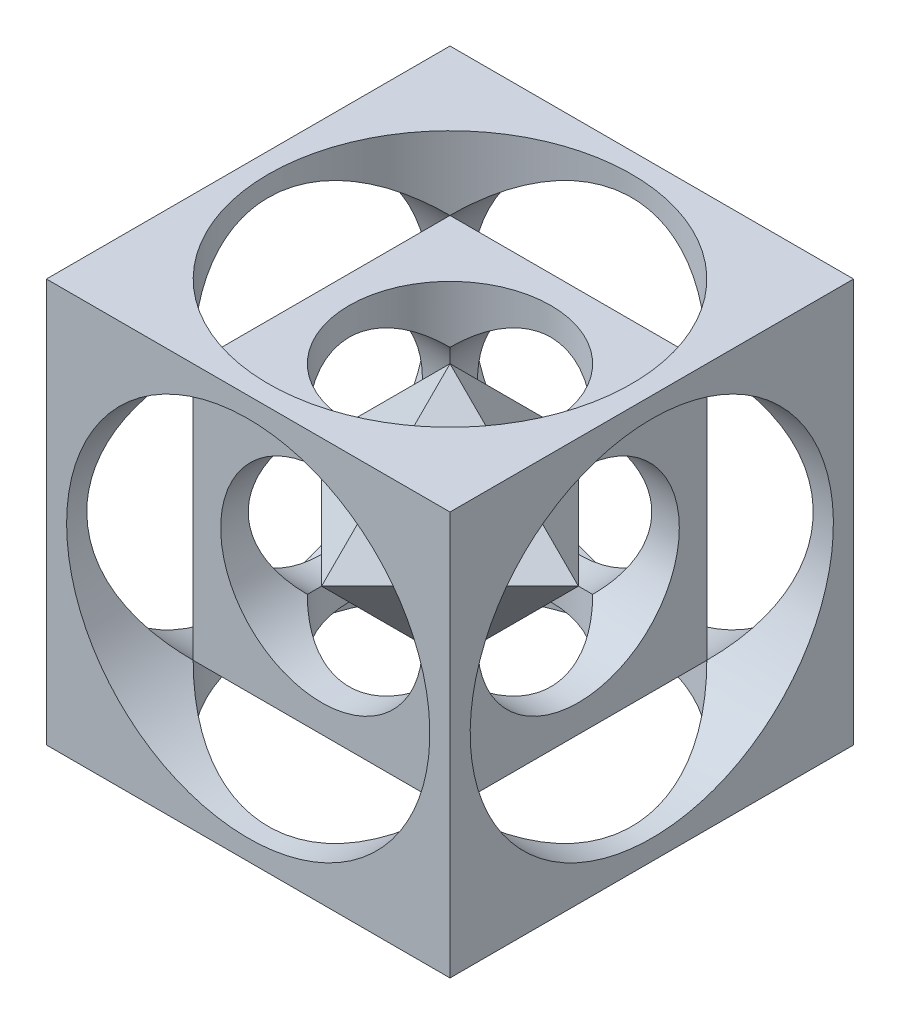
ISO-10303-21;
HEADER;
FILE_DESCRIPTION(('STEP AP214'),'2;1');
FILE_NAME('part.step','',(''),(''),'','','');
FILE_SCHEMA(('AUTOMOTIVE_DESIGN { 1 0 10303 214 1 1 1 1 }'));
ENDSEC;
DATA;
#1=APPLICATION_CONTEXT('core data for automotive mechanical design processes');
#2=APPLICATION_PROTOCOL_DEFINITION('international standard','automotive_design',2000,#1);
#3=PRODUCT_CONTEXT('',#1,'mechanical');
#4=PRODUCT('Part','Part','',(#3));
#5=PRODUCT_RELATED_PRODUCT_CATEGORY('part','',(#4));
#6=PRODUCT_DEFINITION_FORMATION('','',#4);
#7=PRODUCT_DEFINITION_CONTEXT('part definition',#1,'design');
#8=PRODUCT_DEFINITION('design','',#6,#7);
#9=PRODUCT_DEFINITION_SHAPE('','',#8);
#10=(LENGTH_UNIT() NAMED_UNIT(*) SI_UNIT(.MILLI.,.METRE.));
#11=(NAMED_UNIT(*) PLANE_ANGLE_UNIT() SI_UNIT($,.RADIAN.));
#12=(NAMED_UNIT(*) SI_UNIT($,.STERADIAN.) SOLID_ANGLE_UNIT());
#13=UNCERTAINTY_MEASURE_WITH_UNIT(LENGTH_MEASURE(1.E-05),#10,'distance_accuracy_value','');
#14=(GEOMETRIC_REPRESENTATION_CONTEXT(3) GLOBAL_UNCERTAINTY_ASSIGNED_CONTEXT((#13)) GLOBAL_UNIT_ASSIGNED_CONTEXT((#10,
#11,#12)) REPRESENTATION_CONTEXT('',''));
#15=CARTESIAN_POINT('',(0.,0.,0.));
#16=DIRECTION('',(0.,0.,1.));
#17=DIRECTION('',(1.,0.,0.));
#18=AXIS2_PLACEMENT_3D('',#15,#16,#17);
#19=CARTESIAN_POINT('',(0.,0.,0.));
#20=DIRECTION('',(0.,0.,-1.));
#21=DIRECTION('',(1.,0.,0.));
#22=AXIS2_PLACEMENT_3D('',#19,#20,#21);
#23=PLANE('',#22);
#24=CARTESIAN_POINT('',(15.9099025766973,0.,0.));
#25=DIRECTION('',(-0.707106781186548,0.707106781186547,0.));
#26=VECTOR('',#25,1.);
#27=LINE('',#24,#26);
#28=CARTESIAN_POINT('',(15.9099025766973,0.,0.));
#29=VERTEX_POINT('',#28);
#30=CARTESIAN_POINT('',(0.,15.9099025766973,0.));
#31=VERTEX_POINT('',#30);
#32=EDGE_CURVE('E102',#29,#31,#27,.T.);
#33=ORIENTED_EDGE('',*,*,#32,.T.);
#34=CARTESIAN_POINT('',(0.,15.9099025766973,0.));
#35=DIRECTION('',(-0.707106781186547,-0.707106781186548,0.));
#36=VECTOR('',#35,1.);
#37=LINE('',#34,#36);
#38=CARTESIAN_POINT('',(-15.9099025766973,0.,0.));
#39=VERTEX_POINT('',#38);
#40=EDGE_CURVE('E107',#31,#39,#37,.T.);
#41=ORIENTED_EDGE('',*,*,#40,.T.);
#42=CARTESIAN_POINT('',(-15.9099025766973,0.,0.));
#43=DIRECTION('',(0.707106781186548,-0.707106781186547,0.));
#44=VECTOR('',#43,1.);
#45=LINE('',#42,#44);
#46=CARTESIAN_POINT('',(0.,-15.9099025766973,0.));
#47=VERTEX_POINT('',#46);
#48=EDGE_CURVE('E115',#39,#47,#45,.T.);
#49=ORIENTED_EDGE('',*,*,#48,.T.);
#50=CARTESIAN_POINT('',(0.,-15.9099025766973,0.));
#51=DIRECTION('',(0.707106781186547,0.707106781186547,0.));
#52=VECTOR('',#51,1.);
#53=LINE('',#50,#52);
#54=EDGE_CURVE('E118',#47,#29,#53,.T.);
#55=ORIENTED_EDGE('',*,*,#54,.T.);
#56=EDGE_LOOP('',(#33,#41,#49,#55));
#57=FACE_BOUND('',#56,.T.);
#58=ADVANCED_FACE('F68',(#57),#23,.F.);
#59=CARTESIAN_POINT('',(-5.30330085889912,-5.30330085889912,-5.30330085889909));
#60=DIRECTION('',(0.577350269189627,0.577350269189627,0.577350269189624));
#61=DIRECTION('',(-0.707106781186548,0.707106781186547,0.));
#62=AXIS2_PLACEMENT_3D('',#59,#60,#61);
#63=PLANE('',#62);
#64=DIRECTION('',(0.,0.707106781186546,-0.707106781186549));
#65=VECTOR('',#64,1.);
#66=CARTESIAN_POINT('',(0.,-15.9099025766973,0.));
#67=LINE('',#66,#65);
#68=CARTESIAN_POINT('',(0.,0.,-15.9099025766974));
#69=VERTEX_POINT('',#68);
#70=EDGE_CURVE('E151',#47,#69,#67,.T.);
#71=ORIENTED_EDGE('',*,*,#70,.F.);
#72=ORIENTED_EDGE('',*,*,#48,.F.);
#73=DIRECTION('',(0.707106781186546,0.,-0.70710678118655));
#74=VECTOR('',#73,1.);
#75=CARTESIAN_POINT('',(-15.9099025766973,0.,0.));
#76=LINE('',#75,#74);
#77=EDGE_CURVE('E110',#39,#69,#76,.T.);
#78=ORIENTED_EDGE('',*,*,#77,.T.);
#79=EDGE_LOOP('',(#71,#72,#78));
#80=FACE_BOUND('',#79,.T.);
#81=ADVANCED_FACE('F132',(#80),#63,.F.);
#82=CARTESIAN_POINT('',(-5.30330085889912,5.30330085889912,-5.30330085889909));
#83=DIRECTION('',(0.577350269189627,-0.577350269189627,0.577350269189624));
#84=DIRECTION('',(0.707106781186547,0.707106781186548,0.));
#85=AXIS2_PLACEMENT_3D('',#82,#83,#84);
#86=PLANE('',#85);
#87=ORIENTED_EDGE('',*,*,#77,.F.);
#88=ORIENTED_EDGE('',*,*,#40,.F.);
#89=DIRECTION('',(0.,-0.707106781186545,-0.707106781186549));
#90=VECTOR('',#89,1.);
#91=CARTESIAN_POINT('',(0.,15.9099025766973,0.));
#92=LINE('',#91,#90);
#93=EDGE_CURVE('E13',#31,#69,#92,.T.);
#94=ORIENTED_EDGE('',*,*,#93,.T.);
#95=EDGE_LOOP('',(#87,#88,#94));
#96=FACE_BOUND('',#95,.T.);
#97=ADVANCED_FACE('F109',(#96),#86,.F.);
#98=CARTESIAN_POINT('',(5.30330085889912,-5.30330085889912,-5.3033008588991));
#99=DIRECTION('',(-0.577350269189627,0.577350269189627,0.577350269189624));
#100=DIRECTION('',(-0.707106781186547,-0.707106781186547,0.));
#101=AXIS2_PLACEMENT_3D('',#98,#99,#100);
#102=PLANE('',#101);
#103=DIRECTION('',(-0.707106781186546,0.,-0.707106781186549));
#104=VECTOR('',#103,1.);
#105=CARTESIAN_POINT('',(15.9099025766973,0.,0.));
#106=LINE('',#105,#104);
#107=EDGE_CURVE('E80',#29,#69,#106,.T.);
#108=ORIENTED_EDGE('',*,*,#107,.F.);
#109=ORIENTED_EDGE('',*,*,#54,.F.);
#110=ORIENTED_EDGE('',*,*,#70,.T.);
#111=EDGE_LOOP('',(#108,#109,#110));
#112=FACE_BOUND('',#111,.T.);
#113=ADVANCED_FACE('F172',(#112),#102,.F.);
#114=CARTESIAN_POINT('',(5.30330085889913,5.30330085889913,-5.3033008588991));
#115=DIRECTION('',(-0.577350269189627,-0.577350269189627,0.577350269189624));
#116=DIRECTION('',(0.707106781186548,-0.707106781186547,0.));
#117=AXIS2_PLACEMENT_3D('',#114,#115,#116);
#118=PLANE('',#117);
#119=ORIENTED_EDGE('',*,*,#93,.F.);
#120=ORIENTED_EDGE('',*,*,#32,.F.);
#121=ORIENTED_EDGE('',*,*,#107,.T.);
#122=EDGE_LOOP('',(#119,#120,#121));
#123=FACE_BOUND('',#122,.T.);
#124=ADVANCED_FACE('F70',(#123),#118,.F.);
#125=CLOSED_SHELL('',(#58,#81,#97,#113,#124));
#126=MANIFOLD_SOLID_BREP('B2',#125);
#127=CARTESIAN_POINT('',(0.,0.,0.));
#128=DIRECTION('',(0.,0.,1.));
#129=DIRECTION('',(1.,0.,0.));
#130=AXIS2_PLACEMENT_3D('',#127,#128,#129);
#131=PLANE('',#130);
#132=DIRECTION('',(-0.707106781186548,0.707106781186547,0.));
#133=VECTOR('',#132,1.);
#134=CARTESIAN_POINT('',(15.9099025766973,0.,0.));
#135=LINE('',#134,#133);
#136=CARTESIAN_POINT('',(15.9099025766973,0.,0.));
#137=VERTEX_POINT('',#136);
#138=CARTESIAN_POINT('',(0.,15.9099025766973,0.));
#139=VERTEX_POINT('',#138);
#140=EDGE_CURVE('E294',#137,#139,#135,.T.);
#141=ORIENTED_EDGE('',*,*,#140,.F.);
#142=DIRECTION('',(0.707106781186547,0.707106781186547,0.));
#143=VECTOR('',#142,1.);
#144=CARTESIAN_POINT('',(0.,-15.9099025766973,0.));
#145=LINE('',#144,#143);
#146=CARTESIAN_POINT('',(0.,-15.9099025766973,0.));
#147=VERTEX_POINT('',#146);
#148=EDGE_CURVE('E344',#147,#137,#145,.T.);
#149=ORIENTED_EDGE('',*,*,#148,.F.);
#150=DIRECTION('',(0.707106781186548,-0.707106781186547,0.));
#151=VECTOR('',#150,1.);
#152=CARTESIAN_POINT('',(-15.9099025766973,0.,0.));
#153=LINE('',#152,#151);
#154=CARTESIAN_POINT('',(-15.9099025766973,0.,0.));
#155=VERTEX_POINT('',#154);
#156=EDGE_CURVE('E296',#155,#147,#153,.T.);
#157=ORIENTED_EDGE('',*,*,#156,.F.);
#158=DIRECTION('',(-0.707106781186547,-0.707106781186548,0.));
#159=VECTOR('',#158,1.);
#160=CARTESIAN_POINT('',(0.,15.9099025766973,0.));
#161=LINE('',#160,#159);
#162=EDGE_CURVE('E292',#139,#155,#161,.T.);
#163=ORIENTED_EDGE('',*,*,#162,.F.);
#164=EDGE_LOOP('',(#141,#149,#157,#163));
#165=FACE_BOUND('',#164,.T.);
#166=ADVANCED_FACE('F254',(#165),#131,.F.);
#167=CARTESIAN_POINT('',(-5.30330085889912,-5.30330085889912,5.30330085889909));
#168=DIRECTION('',(0.577350269189627,0.577350269189627,-0.577350269189624));
#169=DIRECTION('',(-0.707106781186548,0.707106781186547,0.));
#170=AXIS2_PLACEMENT_3D('',#167,#168,#169);
#171=PLANE('',#170);
#172=DIRECTION('',(0.,0.707106781186546,0.707106781186549));
#173=VECTOR('',#172,1.);
#174=CARTESIAN_POINT('',(0.,-15.9099025766973,0.));
#175=LINE('',#174,#173);
#176=CARTESIAN_POINT('',(0.,0.,15.9099025766974));
#177=VERTEX_POINT('',#176);
#178=EDGE_CURVE('E348',#147,#177,#175,.T.);
#179=ORIENTED_EDGE('',*,*,#178,.T.);
#180=DIRECTION('',(0.707106781186546,0.,0.70710678118655));
#181=VECTOR('',#180,1.);
#182=CARTESIAN_POINT('',(-15.9099025766973,0.,0.));
#183=LINE('',#182,#181);
#184=EDGE_CURVE('E274',#155,#177,#183,.T.);
#185=ORIENTED_EDGE('',*,*,#184,.F.);
#186=ORIENTED_EDGE('',*,*,#156,.T.);
#187=EDGE_LOOP('',(#179,#185,#186));
#188=FACE_BOUND('',#187,.T.);
#189=ADVANCED_FACE('F309',(#188),#171,.F.);
#190=CARTESIAN_POINT('',(-5.30330085889912,5.30330085889912,5.30330085889909));
#191=DIRECTION('',(0.577350269189627,-0.577350269189627,-0.577350269189624));
#192=DIRECTION('',(0.707106781186547,0.707106781186548,0.));
#193=AXIS2_PLACEMENT_3D('',#190,#191,#192);
#194=PLANE('',#193);
#195=ORIENTED_EDGE('',*,*,#184,.T.);
#196=DIRECTION('',(0.,-0.707106781186545,0.707106781186549));
#197=VECTOR('',#196,1.);
#198=CARTESIAN_POINT('',(0.,15.9099025766973,0.));
#199=LINE('',#198,#197);
#200=EDGE_CURVE('E66',#139,#177,#199,.T.);
#201=ORIENTED_EDGE('',*,*,#200,.F.);
#202=ORIENTED_EDGE('',*,*,#162,.T.);
#203=EDGE_LOOP('',(#195,#201,#202));
#204=FACE_BOUND('',#203,.T.);
#205=ADVANCED_FACE('F306',(#204),#194,.F.);
#206=CARTESIAN_POINT('',(5.30330085889912,-5.30330085889912,5.3033008588991));
#207=DIRECTION('',(-0.577350269189627,0.577350269189627,-0.577350269189624));
#208=DIRECTION('',(-0.707106781186547,-0.707106781186547,0.));
#209=AXIS2_PLACEMENT_3D('',#206,#207,#208);
#210=PLANE('',#209);
#211=DIRECTION('',(-0.707106781186546,0.,0.707106781186549));
#212=VECTOR('',#211,1.);
#213=CARTESIAN_POINT('',(15.9099025766973,0.,0.));
#214=LINE('',#213,#212);
#215=EDGE_CURVE('E266',#137,#177,#214,.T.);
#216=ORIENTED_EDGE('',*,*,#215,.T.);
#217=ORIENTED_EDGE('',*,*,#178,.F.);
#218=ORIENTED_EDGE('',*,*,#148,.T.);
#219=EDGE_LOOP('',(#216,#217,#218));
#220=FACE_BOUND('',#219,.T.);
#221=ADVANCED_FACE('F308',(#220),#210,.F.);
#222=CARTESIAN_POINT('',(5.30330085889913,5.30330085889913,5.3033008588991));
#223=DIRECTION('',(-0.577350269189627,-0.577350269189627,-0.577350269189624));
#224=DIRECTION('',(0.707106781186548,-0.707106781186547,0.));
#225=AXIS2_PLACEMENT_3D('',#222,#223,#224);
#226=PLANE('',#225);
#227=ORIENTED_EDGE('',*,*,#200,.T.);
#228=ORIENTED_EDGE('',*,*,#215,.F.);
#229=ORIENTED_EDGE('',*,*,#140,.T.);
#230=EDGE_LOOP('',(#227,#228,#229));
#231=FACE_BOUND('',#230,.T.);
#232=ADVANCED_FACE('F256',(#231),#226,.F.);
#233=CLOSED_SHELL('',(#166,#189,#205,#221,#232));
#234=MANIFOLD_SOLID_BREP('B7',#233);
#235=CARTESIAN_POINT('',(0.,0.,15.9099025766974));
#236=DIRECTION('',(0.,0.,-1.));
#237=DIRECTION('',(-1.,0.,0.));
#238=AXIS2_PLACEMENT_3D('',#235,#236,#237);
#239=CYLINDRICAL_SURFACE('',#238,12.5);
#240=CARTESIAN_POINT('',(0.,0.,0.));
#241=DIRECTION('',(0.,-0.707106781186547,-0.707106781186547));
#242=DIRECTION('',(0.,0.707106781186547,-0.707106781186547));
#243=AXIS2_PLACEMENT_3D('',#240,#241,#242);
#244=ELLIPSE('',#243,17.6776695296637,12.5);
#245=CARTESIAN_POINT('',(-8.83883476483184,-8.83883476483185,8.83883476483184));
#246=VERTEX_POINT('',#245);
#247=CARTESIAN_POINT('',(8.83883476483184,-8.83883476483184,8.83883476483184));
#248=VERTEX_POINT('',#247);
#249=EDGE_CURVE('E473',#246,#248,#244,.F.);
#250=ORIENTED_EDGE('',*,*,#249,.F.);
#251=CARTESIAN_POINT('',(0.,0.,0.));
#252=DIRECTION('',(-0.707106781186547,0.,-0.707106781186547));
#253=DIRECTION('',(0.707106781186547,0.,-0.707106781186547));
#254=AXIS2_PLACEMENT_3D('',#251,#252,#253);
#255=ELLIPSE('',#254,17.6776695296637,12.5);
#256=CARTESIAN_POINT('',(-8.83883476483184,8.83883476483184,8.83883476483184));
#257=VERTEX_POINT('',#256);
#258=EDGE_CURVE('E533',#257,#246,#255,.F.);
#259=ORIENTED_EDGE('',*,*,#258,.F.);
#260=CARTESIAN_POINT('',(0.,0.,0.));
#261=DIRECTION('',(0.,0.707106781186547,-0.707106781186547));
#262=DIRECTION('',(0.,-0.707106781186547,-0.707106781186547));
#263=AXIS2_PLACEMENT_3D('',#260,#261,#262);
#264=ELLIPSE('',#263,17.6776695296637,12.5);
#265=CARTESIAN_POINT('',(8.83883476483184,8.83883476483184,8.83883476483184));
#266=VERTEX_POINT('',#265);
#267=EDGE_CURVE('E545',#266,#257,#264,.F.);
#268=ORIENTED_EDGE('',*,*,#267,.F.);
#269=CARTESIAN_POINT('',(0.,0.,0.));
#270=DIRECTION('',(0.707106781186547,0.,-0.707106781186547));
#271=DIRECTION('',(-0.707106781186547,0.,-0.707106781186547));
#272=AXIS2_PLACEMENT_3D('',#269,#270,#271);
#273=ELLIPSE('',#272,17.6776695296637,12.5);
#274=EDGE_CURVE('E520',#248,#266,#273,.F.);
#275=ORIENTED_EDGE('',*,*,#274,.F.);
#276=EDGE_LOOP('',(#250,#259,#268,#275));
#277=FACE_BOUND('',#276,.T.);
#278=CARTESIAN_POINT('',(0.,0.,15.9099025766974));
#279=DIRECTION('',(0.,0.,1.));
#280=DIRECTION('',(1.,0.,0.));
#281=AXIS2_PLACEMENT_3D('',#278,#279,#280);
#282=CIRCLE('',#281,12.5);
#283=CARTESIAN_POINT('',(12.5,0.,15.9099025766974));
#284=VERTEX_POINT('',#283);
#285=EDGE_CURVE('E575',#284,#284,#282,.T.);
#286=ORIENTED_EDGE('',*,*,#285,.T.);
#287=EDGE_LOOP('',(#286));
#288=FACE_BOUND('',#287,.T.);
#289=ADVANCED_FACE('F451',(#277,#288),#239,.F.);
#290=CARTESIAN_POINT('',(0.,0.,15.9099025766974));
#291=DIRECTION('',(0.,0.,1.));
#292=DIRECTION('',(1.,0.,0.));
#293=AXIS2_PLACEMENT_3D('',#290,#291,#292);
#294=PLANE('',#293);
#295=DIRECTION('',(0.,1.,0.));
#296=VECTOR('',#295,1.);
#297=CARTESIAN_POINT('',(15.9099025766973,15.9099025766973,15.9099025766974));
#298=LINE('',#297,#296);
#299=CARTESIAN_POINT('',(15.9099025766973,-15.9099025766973,15.9099025766974));
#300=VERTEX_POINT('',#299);
#301=CARTESIAN_POINT('',(15.9099025766973,15.9099025766973,15.9099025766974));
#302=VERTEX_POINT('',#301);
#303=EDGE_CURVE('E578',#300,#302,#298,.T.);
#304=ORIENTED_EDGE('',*,*,#303,.T.);
#305=DIRECTION('',(-1.,0.,0.));
#306=VECTOR('',#305,1.);
#307=CARTESIAN_POINT('',(-15.9099025766973,15.9099025766973,15.9099025766974));
#308=LINE('',#307,#306);
#309=CARTESIAN_POINT('',(-15.9099025766973,15.9099025766973,15.9099025766974));
#310=VERTEX_POINT('',#309);
#311=EDGE_CURVE('E581',#302,#310,#308,.T.);
#312=ORIENTED_EDGE('',*,*,#311,.T.);
#313=DIRECTION('',(0.,-1.,0.));
#314=VECTOR('',#313,1.);
#315=CARTESIAN_POINT('',(-15.9099025766973,15.9099025766973,15.9099025766974));
#316=LINE('',#315,#314);
#317=CARTESIAN_POINT('',(-15.9099025766973,-15.9099025766973,15.9099025766974));
#318=VERTEX_POINT('',#317);
#319=EDGE_CURVE('E583',#310,#318,#316,.T.);
#320=ORIENTED_EDGE('',*,*,#319,.T.);
#321=DIRECTION('',(1.,0.,0.));
#322=VECTOR('',#321,1.);
#323=CARTESIAN_POINT('',(-15.9099025766973,-15.9099025766973,15.9099025766974));
#324=LINE('',#323,#322);
#325=EDGE_CURVE('E585',#318,#300,#324,.T.);
#326=ORIENTED_EDGE('',*,*,#325,.T.);
#327=EDGE_LOOP('',(#304,#312,#320,#326));
#328=FACE_BOUND('',#327,.T.);
#329=ORIENTED_EDGE('',*,*,#285,.F.);
#330=EDGE_LOOP('',(#329));
#331=FACE_BOUND('',#330,.T.);
#332=ADVANCED_FACE('F613',(#328,#331),#294,.T.);
#333=CARTESIAN_POINT('',(15.9099025766973,15.9099025766973,15.9099025766974));
#334=DIRECTION('',(-1.,0.,0.));
#335=DIRECTION('',(0.,-1.,0.));
#336=AXIS2_PLACEMENT_3D('',#333,#334,#335);
#337=PLANE('',#336);
#338=CARTESIAN_POINT('',(15.9099025766973,0.,0.));
#339=DIRECTION('',(1.,0.,0.));
#340=DIRECTION('',(0.,1.,0.));
#341=AXIS2_PLACEMENT_3D('',#338,#339,#340);
#342=CIRCLE('',#341,12.5);
#343=CARTESIAN_POINT('',(15.9099025766973,12.5,0.));
#344=VERTEX_POINT('',#343);
#345=EDGE_CURVE('E549',#344,#344,#342,.T.);
#346=ORIENTED_EDGE('',*,*,#345,.F.);
#347=EDGE_LOOP('',(#346));
#348=FACE_BOUND('',#347,.T.);
#349=DIRECTION('',(0.,0.,-1.));
#350=VECTOR('',#349,1.);
#351=CARTESIAN_POINT('',(15.9099025766973,-15.9099025766973,15.9099025766974));
#352=LINE('',#351,#350);
#353=CARTESIAN_POINT('',(15.9099025766973,-15.9099025766973,-15.9099025766973));
#354=VERTEX_POINT('',#353);
#355=EDGE_CURVE('E587',#300,#354,#352,.T.);
#356=ORIENTED_EDGE('',*,*,#355,.T.);
#357=DIRECTION('',(0.,1.,0.));
#358=VECTOR('',#357,1.);
#359=CARTESIAN_POINT('',(15.9099025766973,15.9099025766973,-15.9099025766973));
#360=LINE('',#359,#358);
#361=CARTESIAN_POINT('',(15.9099025766973,15.9099025766973,-15.9099025766973));
#362=VERTEX_POINT('',#361);
#363=EDGE_CURVE('E563',#354,#362,#360,.T.);
#364=ORIENTED_EDGE('',*,*,#363,.T.);
#365=DIRECTION('',(0.,0.,-1.));
#366=VECTOR('',#365,1.);
#367=CARTESIAN_POINT('',(15.9099025766973,15.9099025766973,15.9099025766974));
#368=LINE('',#367,#366);
#369=EDGE_CURVE('E537',#302,#362,#368,.T.);
#370=ORIENTED_EDGE('',*,*,#369,.F.);
#371=ORIENTED_EDGE('',*,*,#303,.F.);
#372=EDGE_LOOP('',(#356,#364,#370,#371));
#373=FACE_BOUND('',#372,.T.);
#374=ADVANCED_FACE('F453',(#348,#373),#337,.F.);
#375=CARTESIAN_POINT('',(-15.9099025766973,15.9099025766973,15.9099025766974));
#376=DIRECTION('',(0.,-1.,0.));
#377=DIRECTION('',(0.,0.,-1.));
#378=AXIS2_PLACEMENT_3D('',#375,#376,#377);
#379=PLANE('',#378);
#380=CARTESIAN_POINT('',(0.,15.9099025766973,0.));
#381=DIRECTION('',(0.,-1.,0.));
#382=DIRECTION('',(0.,0.,-1.));
#383=AXIS2_PLACEMENT_3D('',#380,#381,#382);
#384=CIRCLE('',#383,12.5);
#385=CARTESIAN_POINT('',(0.,15.9099025766973,-12.5));
#386=VERTEX_POINT('',#385);
#387=EDGE_CURVE('E529',#386,#386,#384,.F.);
#388=ORIENTED_EDGE('',*,*,#387,.F.);
#389=EDGE_LOOP('',(#388));
#390=FACE_BOUND('',#389,.T.);
#391=ORIENTED_EDGE('',*,*,#369,.T.);
#392=DIRECTION('',(-1.,0.,0.));
#393=VECTOR('',#392,1.);
#394=CARTESIAN_POINT('',(-15.9099025766973,15.9099025766973,-15.9099025766973));
#395=LINE('',#394,#393);
#396=CARTESIAN_POINT('',(-15.9099025766973,15.9099025766973,-15.9099025766973));
#397=VERTEX_POINT('',#396);
#398=EDGE_CURVE('E566',#362,#397,#395,.T.);
#399=ORIENTED_EDGE('',*,*,#398,.T.);
#400=DIRECTION('',(0.,0.,-1.));
#401=VECTOR('',#400,1.);
#402=CARTESIAN_POINT('',(-15.9099025766973,15.9099025766973,15.9099025766974));
#403=LINE('',#402,#401);
#404=EDGE_CURVE('E591',#310,#397,#403,.T.);
#405=ORIENTED_EDGE('',*,*,#404,.F.);
#406=ORIENTED_EDGE('',*,*,#311,.F.);
#407=EDGE_LOOP('',(#391,#399,#405,#406));
#408=FACE_BOUND('',#407,.T.);
#409=ADVANCED_FACE('F595',(#390,#408),#379,.F.);
#410=CARTESIAN_POINT('',(-15.9099025766973,15.9099025766973,15.9099025766974));
#411=DIRECTION('',(1.,0.,0.));
#412=DIRECTION('',(0.,1.,0.));
#413=AXIS2_PLACEMENT_3D('',#410,#411,#412);
#414=PLANE('',#413);
#415=CARTESIAN_POINT('',(-15.9099025766973,0.,0.));
#416=DIRECTION('',(1.,0.,0.));
#417=DIRECTION('',(0.,1.,0.));
#418=AXIS2_PLACEMENT_3D('',#415,#416,#417);
#419=CIRCLE('',#418,12.5);
#420=CARTESIAN_POINT('',(-15.9099025766973,12.5,0.));
#421=VERTEX_POINT('',#420);
#422=EDGE_CURVE('E557',#421,#421,#419,.F.);
#423=ORIENTED_EDGE('',*,*,#422,.F.);
#424=EDGE_LOOP('',(#423));
#425=FACE_BOUND('',#424,.T.);
#426=ORIENTED_EDGE('',*,*,#404,.T.);
#427=DIRECTION('',(0.,-1.,0.));
#428=VECTOR('',#427,1.);
#429=CARTESIAN_POINT('',(-15.9099025766973,15.9099025766973,-15.9099025766973));
#430=LINE('',#429,#428);
#431=CARTESIAN_POINT('',(-15.9099025766973,-15.9099025766973,-15.9099025766973));
#432=VERTEX_POINT('',#431);
#433=EDGE_CURVE('E569',#397,#432,#430,.T.);
#434=ORIENTED_EDGE('',*,*,#433,.T.);
#435=DIRECTION('',(0.,0.,-1.));
#436=VECTOR('',#435,1.);
#437=CARTESIAN_POINT('',(-15.9099025766973,-15.9099025766973,15.9099025766974));
#438=LINE('',#437,#436);
#439=EDGE_CURVE('E589',#318,#432,#438,.T.);
#440=ORIENTED_EDGE('',*,*,#439,.F.);
#441=ORIENTED_EDGE('',*,*,#319,.F.);
#442=EDGE_LOOP('',(#426,#434,#440,#441));
#443=FACE_BOUND('',#442,.T.);
#444=ADVANCED_FACE('F611',(#425,#443),#414,.F.);
#445=CARTESIAN_POINT('',(-15.9099025766973,-15.9099025766973,15.9099025766974));
#446=DIRECTION('',(0.,1.,0.));
#447=DIRECTION('',(0.,0.,1.));
#448=AXIS2_PLACEMENT_3D('',#445,#446,#447);
#449=PLANE('',#448);
#450=CARTESIAN_POINT('',(0.,-15.9099025766973,0.));
#451=DIRECTION('',(0.,-1.,0.));
#452=DIRECTION('',(0.,0.,-1.));
#453=AXIS2_PLACEMENT_3D('',#450,#451,#452);
#454=CIRCLE('',#453,12.5);
#455=CARTESIAN_POINT('',(0.,-15.9099025766973,-12.5));
#456=VERTEX_POINT('',#455);
#457=EDGE_CURVE('E647',#456,#456,#454,.T.);
#458=ORIENTED_EDGE('',*,*,#457,.F.);
#459=EDGE_LOOP('',(#458));
#460=FACE_BOUND('',#459,.T.);
#461=ORIENTED_EDGE('',*,*,#439,.T.);
#462=DIRECTION('',(1.,0.,0.));
#463=VECTOR('',#462,1.);
#464=CARTESIAN_POINT('',(-15.9099025766973,-15.9099025766973,-15.9099025766973));
#465=LINE('',#464,#463);
#466=EDGE_CURVE('E572',#432,#354,#465,.T.);
#467=ORIENTED_EDGE('',*,*,#466,.T.);
#468=ORIENTED_EDGE('',*,*,#355,.F.);
#469=ORIENTED_EDGE('',*,*,#325,.F.);
#470=EDGE_LOOP('',(#461,#467,#468,#469));
#471=FACE_BOUND('',#470,.T.);
#472=ADVANCED_FACE('F607',(#460,#471),#449,.F.);
#473=CARTESIAN_POINT('',(0.,0.,0.));
#474=DIRECTION('',(0.,-0.707106781186547,-0.707106781186547));
#475=DIRECTION('',(0.,0.707106781186547,-0.707106781186547));
#476=AXIS2_PLACEMENT_3D('',#473,#474,#475);
#477=ELLIPSE('',#476,17.6776695296637,12.5);
#478=CARTESIAN_POINT('',(-8.83883476483184,8.83883476483184,-8.83883476483184));
#479=VERTEX_POINT('',#478);
#480=CARTESIAN_POINT('',(8.83883476483184,8.83883476483184,-8.83883476483184));
#481=VERTEX_POINT('',#480);
#482=EDGE_CURVE('E466',#479,#481,#477,.T.);
#483=ORIENTED_EDGE('',*,*,#482,.F.);
#484=CARTESIAN_POINT('',(0.,0.,0.));
#485=DIRECTION('',(0.707106781186547,0.,-0.707106781186547));
#486=DIRECTION('',(-0.707106781186547,0.,-0.707106781186547));
#487=AXIS2_PLACEMENT_3D('',#484,#485,#486);
#488=ELLIPSE('',#487,17.6776695296637,12.5);
#489=CARTESIAN_POINT('',(-8.83883476483184,-8.83883476483185,-8.83883476483184));
#490=VERTEX_POINT('',#489);
#491=EDGE_CURVE('E528',#490,#479,#488,.T.);
#492=ORIENTED_EDGE('',*,*,#491,.F.);
#493=CARTESIAN_POINT('',(0.,0.,0.));
#494=DIRECTION('',(0.,0.707106781186547,-0.707106781186547));
#495=DIRECTION('',(0.,-0.707106781186547,-0.707106781186547));
#496=AXIS2_PLACEMENT_3D('',#493,#494,#495);
#497=ELLIPSE('',#496,17.6776695296637,12.5);
#498=CARTESIAN_POINT('',(8.83883476483184,-8.83883476483184,-8.83883476483184));
#499=VERTEX_POINT('',#498);
#500=EDGE_CURVE('E514',#499,#490,#497,.T.);
#501=ORIENTED_EDGE('',*,*,#500,.F.);
#502=CARTESIAN_POINT('',(0.,0.,0.));
#503=DIRECTION('',(-0.707106781186547,0.,-0.707106781186547));
#504=DIRECTION('',(0.707106781186547,0.,-0.707106781186547));
#505=AXIS2_PLACEMENT_3D('',#502,#503,#504);
#506=ELLIPSE('',#505,17.6776695296637,12.5);
#507=EDGE_CURVE('E526',#481,#499,#506,.T.);
#508=ORIENTED_EDGE('',*,*,#507,.F.);
#509=EDGE_LOOP('',(#483,#492,#501,#508));
#510=FACE_BOUND('',#509,.T.);
#511=CARTESIAN_POINT('',(0.,0.,-15.9099025766973));
#512=DIRECTION('',(0.,0.,1.));
#513=DIRECTION('',(1.,0.,0.));
#514=AXIS2_PLACEMENT_3D('',#511,#512,#513);
#515=CIRCLE('',#514,12.5);
#516=CARTESIAN_POINT('',(12.5,0.,-15.9099025766973));
#517=VERTEX_POINT('',#516);
#518=EDGE_CURVE('E560',#517,#517,#515,.T.);
#519=ORIENTED_EDGE('',*,*,#518,.F.);
#520=EDGE_LOOP('',(#519));
#521=FACE_BOUND('',#520,.T.);
#522=ADVANCED_FACE('F524',(#510,#521),#239,.F.);
#523=CARTESIAN_POINT('',(0.,0.,-15.9099025766973));
#524=DIRECTION('',(0.,0.,1.));
#525=DIRECTION('',(1.,0.,0.));
#526=AXIS2_PLACEMENT_3D('',#523,#524,#525);
#527=PLANE('',#526);
#528=ORIENTED_EDGE('',*,*,#518,.T.);
#529=EDGE_LOOP('',(#528));
#530=FACE_BOUND('',#529,.T.);
#531=ORIENTED_EDGE('',*,*,#363,.F.);
#532=ORIENTED_EDGE('',*,*,#466,.F.);
#533=ORIENTED_EDGE('',*,*,#433,.F.);
#534=ORIENTED_EDGE('',*,*,#398,.F.);
#535=EDGE_LOOP('',(#531,#532,#533,#534));
#536=FACE_BOUND('',#535,.T.);
#537=ADVANCED_FACE('F602',(#530,#536),#527,.F.);
#538=CARTESIAN_POINT('',(-51.2652416360247,0.,0.));
#539=DIRECTION('',(1.,0.,0.));
#540=DIRECTION('',(0.,1.,0.));
#541=AXIS2_PLACEMENT_3D('',#538,#539,#540);
#542=CYLINDRICAL_SURFACE('',#541,12.5);
#543=ORIENTED_EDGE('',*,*,#258,.T.);
#544=CARTESIAN_POINT('',(0.,0.,0.));
#545=DIRECTION('',(0.707106781186548,-0.707106781186547,0.));
#546=DIRECTION('',(0.707106781186547,0.707106781186547,0.));
#547=AXIS2_PLACEMENT_3D('',#544,#545,#546);
#548=ELLIPSE('',#547,17.6776695296637,12.5);
#549=EDGE_CURVE('E551',#246,#490,#548,.T.);
#550=ORIENTED_EDGE('',*,*,#549,.T.);
#551=ORIENTED_EDGE('',*,*,#491,.T.);
#552=CARTESIAN_POINT('',(0.,0.,0.));
#553=DIRECTION('',(0.707106781186547,0.707106781186547,0.));
#554=DIRECTION('',(0.707106781186548,-0.707106781186547,0.));
#555=AXIS2_PLACEMENT_3D('',#552,#553,#554);
#556=ELLIPSE('',#555,17.6776695296637,12.5);
#557=EDGE_CURVE('E547',#479,#257,#556,.T.);
#558=ORIENTED_EDGE('',*,*,#557,.T.);
#559=EDGE_LOOP('',(#543,#550,#551,#558));
#560=FACE_BOUND('',#559,.T.);
#561=ORIENTED_EDGE('',*,*,#422,.T.);
#562=EDGE_LOOP('',(#561));
#563=FACE_BOUND('',#562,.T.);
#564=ADVANCED_FACE('F628',(#560,#563),#542,.F.);
#565=ORIENTED_EDGE('',*,*,#274,.T.);
#566=CARTESIAN_POINT('',(0.,0.,0.));
#567=DIRECTION('',(0.707106781186548,-0.707106781186547,0.));
#568=DIRECTION('',(0.707106781186547,0.707106781186547,0.));
#569=AXIS2_PLACEMENT_3D('',#566,#567,#568);
#570=ELLIPSE('',#569,17.6776695296637,12.5);
#571=EDGE_CURVE('E252',#266,#481,#570,.F.);
#572=ORIENTED_EDGE('',*,*,#571,.T.);
#573=ORIENTED_EDGE('',*,*,#507,.T.);
#574=CARTESIAN_POINT('',(0.,0.,0.));
#575=DIRECTION('',(0.707106781186547,0.707106781186547,0.));
#576=DIRECTION('',(0.707106781186548,-0.707106781186547,0.));
#577=AXIS2_PLACEMENT_3D('',#574,#575,#576);
#578=ELLIPSE('',#577,17.6776695296637,12.5);
#579=EDGE_CURVE('E459',#499,#248,#578,.F.);
#580=ORIENTED_EDGE('',*,*,#579,.T.);
#581=EDGE_LOOP('',(#565,#572,#573,#580));
#582=FACE_BOUND('',#581,.T.);
#583=ORIENTED_EDGE('',*,*,#345,.T.);
#584=EDGE_LOOP('',(#583));
#585=FACE_BOUND('',#584,.T.);
#586=ADVANCED_FACE('F531',(#582,#585),#542,.F.);
#587=CARTESIAN_POINT('',(0.,51.2652416360247,0.));
#588=DIRECTION('',(0.,-1.,0.));
#589=DIRECTION('',(0.,0.,-1.));
#590=AXIS2_PLACEMENT_3D('',#587,#588,#589);
#591=CYLINDRICAL_SURFACE('',#590,12.5);
#592=ORIENTED_EDGE('',*,*,#457,.T.);
#593=EDGE_LOOP('',(#592));
#594=FACE_BOUND('',#593,.T.);
#595=ORIENTED_EDGE('',*,*,#249,.T.);
#596=ORIENTED_EDGE('',*,*,#579,.F.);
#597=ORIENTED_EDGE('',*,*,#500,.T.);
#598=ORIENTED_EDGE('',*,*,#549,.F.);
#599=EDGE_LOOP('',(#595,#596,#597,#598));
#600=FACE_BOUND('',#599,.T.);
#601=ADVANCED_FACE('F513',(#594,#600),#591,.F.);
#602=ORIENTED_EDGE('',*,*,#387,.T.);
#603=EDGE_LOOP('',(#602));
#604=FACE_BOUND('',#603,.T.);
#605=ORIENTED_EDGE('',*,*,#482,.T.);
#606=ORIENTED_EDGE('',*,*,#571,.F.);
#607=ORIENTED_EDGE('',*,*,#267,.T.);
#608=ORIENTED_EDGE('',*,*,#557,.F.);
#609=EDGE_LOOP('',(#605,#606,#607,#608));
#610=FACE_BOUND('',#609,.T.);
#611=ADVANCED_FACE('F654',(#604,#610),#591,.F.);
#612=CLOSED_SHELL('',(#289,#332,#374,#409,#444,#472,#522,#537,#564,#586,#601,#611));
#613=MANIFOLD_SOLID_BREP('B60',#612);
#614=CARTESIAN_POINT('',(-25.,0.,0.));
#615=DIRECTION('',(1.,0.,0.));
#616=DIRECTION('',(0.,1.,0.));
#617=AXIS2_PLACEMENT_3D('',#614,#615,#616);
#618=CYLINDRICAL_SURFACE('',#617,22.5);
#619=CARTESIAN_POINT('',(25.,0.,0.));
#620=DIRECTION('',(1.,0.,0.));
#621=DIRECTION('',(0.,1.,0.));
#622=AXIS2_PLACEMENT_3D('',#619,#620,#621);
#623=CIRCLE('',#622,22.5);
#624=CARTESIAN_POINT('',(25.,22.5,0.));
#625=VERTEX_POINT('',#624);
#626=EDGE_CURVE('E840',#625,#625,#623,.T.);
#627=ORIENTED_EDGE('',*,*,#626,.T.);
#628=EDGE_LOOP('',(#627));
#629=FACE_BOUND('',#628,.T.);
#630=CARTESIAN_POINT('',(0.,0.,0.));
#631=DIRECTION('',(-0.707106781186544,-0.707106781186551,0.));
#632=DIRECTION('',(-0.707106781186551,0.707106781186544,0.));
#633=AXIS2_PLACEMENT_3D('',#630,#631,#632);
#634=ELLIPSE('',#633,31.8198051533948,22.5);
#635=CARTESIAN_POINT('',(15.9099025766974,-15.9099025766973,-15.9099025766973));
#636=VERTEX_POINT('',#635);
#637=CARTESIAN_POINT('',(15.9099025766974,-15.9099025766973,15.9099025766973));
#638=VERTEX_POINT('',#637);
#639=EDGE_CURVE('E824',#636,#638,#634,.T.);
#640=ORIENTED_EDGE('',*,*,#639,.T.);
#641=CARTESIAN_POINT('',(0.,0.,0.));
#642=DIRECTION('',(0.707106781186547,0.,-0.707106781186547));
#643=DIRECTION('',(0.707106781186547,0.,0.707106781186547));
#644=AXIS2_PLACEMENT_3D('',#641,#642,#643);
#645=ELLIPSE('',#644,31.8198051533946,22.5);
#646=CARTESIAN_POINT('',(15.9099025766972,15.9099025766974,15.9099025766972));
#647=VERTEX_POINT('',#646);
#648=EDGE_CURVE('E755',#638,#647,#645,.F.);
#649=ORIENTED_EDGE('',*,*,#648,.T.);
#650=CARTESIAN_POINT('',(0.,0.,0.));
#651=DIRECTION('',(-0.707106781186551,0.707106781186544,0.));
#652=DIRECTION('',(-0.707106781186544,-0.707106781186551,0.));
#653=AXIS2_PLACEMENT_3D('',#650,#651,#652);
#654=ELLIPSE('',#653,31.8198051533945,22.5);
#655=CARTESIAN_POINT('',(15.9099025766972,15.9099025766974,-15.9099025766972));
#656=VERTEX_POINT('',#655);
#657=EDGE_CURVE('E818',#647,#656,#654,.T.);
#658=ORIENTED_EDGE('',*,*,#657,.T.);
#659=CARTESIAN_POINT('',(0.,0.,0.));
#660=DIRECTION('',(0.707106781186547,0.,0.707106781186547));
#661=DIRECTION('',(0.707106781186547,0.,-0.707106781186547));
#662=AXIS2_PLACEMENT_3D('',#659,#660,#661);
#663=ELLIPSE('',#662,31.8198051533946,22.5);
#664=EDGE_CURVE('E827',#656,#636,#663,.F.);
#665=ORIENTED_EDGE('',*,*,#664,.T.);
#666=EDGE_LOOP('',(#640,#649,#658,#665));
#667=FACE_BOUND('',#666,.T.);
#668=ADVANCED_FACE('F732',(#629,#667),#618,.F.);
#669=CARTESIAN_POINT('',(25.,25.,25.));
#670=DIRECTION('',(-1.,0.,0.));
#671=DIRECTION('',(0.,-1.,0.));
#672=AXIS2_PLACEMENT_3D('',#669,#670,#671);
#673=PLANE('',#672);
#674=ORIENTED_EDGE('',*,*,#626,.F.);
#675=EDGE_LOOP('',(#674));
#676=FACE_BOUND('',#675,.T.);
#677=DIRECTION('',(0.,1.,0.));
#678=VECTOR('',#677,1.);
#679=CARTESIAN_POINT('',(25.,25.,-25.));
#680=LINE('',#679,#678);
#681=CARTESIAN_POINT('',(25.,-25.,-25.));
#682=VERTEX_POINT('',#681);
#683=CARTESIAN_POINT('',(25.,25.,-25.));
#684=VERTEX_POINT('',#683);
#685=EDGE_CURVE('E848',#682,#684,#680,.T.);
#686=ORIENTED_EDGE('',*,*,#685,.T.);
#687=DIRECTION('',(0.,0.,-1.));
#688=VECTOR('',#687,1.);
#689=CARTESIAN_POINT('',(25.,25.,25.));
#690=LINE('',#689,#688);
#691=CARTESIAN_POINT('',(25.,25.,25.));
#692=VERTEX_POINT('',#691);
#693=EDGE_CURVE('E803',#692,#684,#690,.T.);
#694=ORIENTED_EDGE('',*,*,#693,.F.);
#695=DIRECTION('',(0.,1.,0.));
#696=VECTOR('',#695,1.);
#697=CARTESIAN_POINT('',(25.,25.,25.));
#698=LINE('',#697,#696);
#699=CARTESIAN_POINT('',(25.,-25.,25.));
#700=VERTEX_POINT('',#699);
#701=EDGE_CURVE('E852',#700,#692,#698,.T.);
#702=ORIENTED_EDGE('',*,*,#701,.F.);
#703=DIRECTION('',(0.,0.,-1.));
#704=VECTOR('',#703,1.);
#705=CARTESIAN_POINT('',(25.,-25.,25.));
#706=LINE('',#705,#704);
#707=EDGE_CURVE('E866',#700,#682,#706,.T.);
#708=ORIENTED_EDGE('',*,*,#707,.T.);
#709=EDGE_LOOP('',(#686,#694,#702,#708));
#710=FACE_BOUND('',#709,.T.);
#711=ADVANCED_FACE('F734',(#676,#710),#673,.F.);
#712=CARTESIAN_POINT('',(-25.,25.,25.));
#713=DIRECTION('',(0.,-1.,0.));
#714=DIRECTION('',(0.,0.,-1.));
#715=AXIS2_PLACEMENT_3D('',#712,#713,#714);
#716=PLANE('',#715);
#717=CARTESIAN_POINT('',(0.,25.,0.));
#718=DIRECTION('',(0.,1.,0.));
#719=DIRECTION('',(-1.,0.,0.));
#720=AXIS2_PLACEMENT_3D('',#717,#718,#719);
#721=CIRCLE('',#720,22.5);
#722=CARTESIAN_POINT('',(-22.5000000000001,24.9999999999999,0.));
#723=VERTEX_POINT('',#722);
#724=EDGE_CURVE('E835',#723,#723,#721,.T.);
#725=ORIENTED_EDGE('',*,*,#724,.F.);
#726=EDGE_LOOP('',(#725));
#727=FACE_BOUND('',#726,.T.);
#728=DIRECTION('',(-1.,0.,0.));
#729=VECTOR('',#728,1.);
#730=CARTESIAN_POINT('',(-25.,25.,-25.));
#731=LINE('',#730,#729);
#732=CARTESIAN_POINT('',(-25.,25.,-25.));
#733=VERTEX_POINT('',#732);
#734=EDGE_CURVE('E870',#684,#733,#731,.T.);
#735=ORIENTED_EDGE('',*,*,#734,.T.);
#736=DIRECTION('',(0.,0.,-1.));
#737=VECTOR('',#736,1.);
#738=CARTESIAN_POINT('',(-25.,25.,25.));
#739=LINE('',#738,#737);
#740=CARTESIAN_POINT('',(-25.,25.,25.));
#741=VERTEX_POINT('',#740);
#742=EDGE_CURVE('E885',#741,#733,#739,.T.);
#743=ORIENTED_EDGE('',*,*,#742,.F.);
#744=DIRECTION('',(-1.,0.,0.));
#745=VECTOR('',#744,1.);
#746=CARTESIAN_POINT('',(-25.,25.,25.));
#747=LINE('',#746,#745);
#748=EDGE_CURVE('E856',#692,#741,#747,.T.);
#749=ORIENTED_EDGE('',*,*,#748,.F.);
#750=ORIENTED_EDGE('',*,*,#693,.T.);
#751=EDGE_LOOP('',(#735,#743,#749,#750));
#752=FACE_BOUND('',#751,.T.);
#753=ADVANCED_FACE('F893',(#727,#752),#716,.F.);
#754=CARTESIAN_POINT('',(-25.,25.,25.));
#755=DIRECTION('',(1.,0.,0.));
#756=DIRECTION('',(0.,1.,0.));
#757=AXIS2_PLACEMENT_3D('',#754,#755,#756);
#758=PLANE('',#757);
#759=CARTESIAN_POINT('',(-25.,0.,0.));
#760=DIRECTION('',(1.,0.,0.));
#761=DIRECTION('',(0.,1.,0.));
#762=AXIS2_PLACEMENT_3D('',#759,#760,#761);
#763=CIRCLE('',#762,22.5);
#764=CARTESIAN_POINT('',(-25.,22.5,0.));
#765=VERTEX_POINT('',#764);
#766=EDGE_CURVE('E844',#765,#765,#763,.T.);
#767=ORIENTED_EDGE('',*,*,#766,.T.);
#768=EDGE_LOOP('',(#767));
#769=FACE_BOUND('',#768,.T.);
#770=DIRECTION('',(0.,-1.,0.));
#771=VECTOR('',#770,1.);
#772=CARTESIAN_POINT('',(-25.,25.,-25.));
#773=LINE('',#772,#771);
#774=CARTESIAN_POINT('',(-25.,-25.,-25.));
#775=VERTEX_POINT('',#774);
#776=EDGE_CURVE('E873',#733,#775,#773,.T.);
#777=ORIENTED_EDGE('',*,*,#776,.T.);
#778=DIRECTION('',(0.,0.,-1.));
#779=VECTOR('',#778,1.);
#780=CARTESIAN_POINT('',(-25.,-25.,25.));
#781=LINE('',#780,#779);
#782=CARTESIAN_POINT('',(-25.,-25.,25.));
#783=VERTEX_POINT('',#782);
#784=EDGE_CURVE('E881',#783,#775,#781,.T.);
#785=ORIENTED_EDGE('',*,*,#784,.F.);
#786=DIRECTION('',(0.,-1.,0.));
#787=VECTOR('',#786,1.);
#788=CARTESIAN_POINT('',(-25.,25.,25.));
#789=LINE('',#788,#787);
#790=EDGE_CURVE('E860',#741,#783,#789,.T.);
#791=ORIENTED_EDGE('',*,*,#790,.F.);
#792=ORIENTED_EDGE('',*,*,#742,.T.);
#793=EDGE_LOOP('',(#777,#785,#791,#792));
#794=FACE_BOUND('',#793,.T.);
#795=ADVANCED_FACE('F905',(#769,#794),#758,.F.);
#796=CARTESIAN_POINT('',(-25.,-25.,25.));
#797=DIRECTION('',(0.,1.,0.));
#798=DIRECTION('',(0.,0.,1.));
#799=AXIS2_PLACEMENT_3D('',#796,#797,#798);
#800=PLANE('',#799);
#801=CARTESIAN_POINT('',(0.,-25.0000000000001,0.));
#802=DIRECTION('',(0.,1.,0.));
#803=DIRECTION('',(-1.,0.,0.));
#804=AXIS2_PLACEMENT_3D('',#801,#802,#803);
#805=CIRCLE('',#804,22.5);
#806=CARTESIAN_POINT('',(-22.4999999999999,-25.0000000000002,0.));
#807=VERTEX_POINT('',#806);
#808=EDGE_CURVE('E836',#807,#807,#805,.T.);
#809=ORIENTED_EDGE('',*,*,#808,.T.);
#810=EDGE_LOOP('',(#809));
#811=FACE_BOUND('',#810,.T.);
#812=DIRECTION('',(1.,0.,0.));
#813=VECTOR('',#812,1.);
#814=CARTESIAN_POINT('',(-25.,-25.,-25.));
#815=LINE('',#814,#813);
#816=EDGE_CURVE('E857',#775,#682,#815,.T.);
#817=ORIENTED_EDGE('',*,*,#816,.T.);
#818=ORIENTED_EDGE('',*,*,#707,.F.);
#819=DIRECTION('',(1.,0.,0.));
#820=VECTOR('',#819,1.);
#821=CARTESIAN_POINT('',(-25.,-25.,25.));
#822=LINE('',#821,#820);
#823=EDGE_CURVE('E863',#783,#700,#822,.T.);
#824=ORIENTED_EDGE('',*,*,#823,.F.);
#825=ORIENTED_EDGE('',*,*,#784,.T.);
#826=EDGE_LOOP('',(#817,#818,#824,#825));
#827=FACE_BOUND('',#826,.T.);
#828=ADVANCED_FACE('F909',(#811,#827),#800,.F.);
#829=CARTESIAN_POINT('',(0.,0.,25.));
#830=DIRECTION('',(0.,0.,1.));
#831=DIRECTION('',(1.,0.,0.));
#832=AXIS2_PLACEMENT_3D('',#829,#830,#831);
#833=PLANE('',#832);
#834=CARTESIAN_POINT('',(0.,0.,25.));
#835=DIRECTION('',(0.,0.,-1.));
#836=DIRECTION('',(-1.,0.,0.));
#837=AXIS2_PLACEMENT_3D('',#834,#835,#836);
#838=CIRCLE('',#837,22.5);
#839=CARTESIAN_POINT('',(-22.5,0.,25.));
#840=VERTEX_POINT('',#839);
#841=EDGE_CURVE('E813',#840,#840,#838,.T.);
#842=ORIENTED_EDGE('',*,*,#841,.T.);
#843=EDGE_LOOP('',(#842));
#844=FACE_BOUND('',#843,.T.);
#845=ORIENTED_EDGE('',*,*,#701,.T.);
#846=ORIENTED_EDGE('',*,*,#748,.T.);
#847=ORIENTED_EDGE('',*,*,#790,.T.);
#848=ORIENTED_EDGE('',*,*,#823,.T.);
#849=EDGE_LOOP('',(#845,#846,#847,#848));
#850=FACE_BOUND('',#849,.T.);
#851=ADVANCED_FACE('F911',(#844,#850),#833,.T.);
#852=CARTESIAN_POINT('',(0.,0.,-25.));
#853=DIRECTION('',(0.,0.,1.));
#854=DIRECTION('',(1.,0.,0.));
#855=AXIS2_PLACEMENT_3D('',#852,#853,#854);
#856=PLANE('',#855);
#857=CARTESIAN_POINT('',(0.,0.,-25.));
#858=DIRECTION('',(0.,0.,-1.));
#859=DIRECTION('',(-1.,0.,0.));
#860=AXIS2_PLACEMENT_3D('',#857,#858,#859);
#861=CIRCLE('',#860,22.5);
#862=CARTESIAN_POINT('',(-22.5,0.,-25.));
#863=VERTEX_POINT('',#862);
#864=EDGE_CURVE('E954',#863,#863,#861,.T.);
#865=ORIENTED_EDGE('',*,*,#864,.F.);
#866=EDGE_LOOP('',(#865));
#867=FACE_BOUND('',#866,.T.);
#868=ORIENTED_EDGE('',*,*,#685,.F.);
#869=ORIENTED_EDGE('',*,*,#816,.F.);
#870=ORIENTED_EDGE('',*,*,#776,.F.);
#871=ORIENTED_EDGE('',*,*,#734,.F.);
#872=EDGE_LOOP('',(#868,#869,#870,#871));
#873=FACE_BOUND('',#872,.T.);
#874=ADVANCED_FACE('F901',(#867,#873),#856,.F.);
#875=CARTESIAN_POINT('',(0.,0.,0.));
#876=DIRECTION('',(-0.707106781186551,0.707106781186544,0.));
#877=DIRECTION('',(-0.707106781186544,-0.707106781186551,0.));
#878=AXIS2_PLACEMENT_3D('',#875,#876,#877);
#879=ELLIPSE('',#878,31.8198051533945,22.5);
#880=CARTESIAN_POINT('',(-15.9099025766972,-15.9099025766974,15.9099025766973));
#881=VERTEX_POINT('',#880);
#882=CARTESIAN_POINT('',(-15.9099025766972,-15.9099025766974,-15.9099025766973));
#883=VERTEX_POINT('',#882);
#884=EDGE_CURVE('E809',#881,#883,#879,.F.);
#885=ORIENTED_EDGE('',*,*,#884,.T.);
#886=CARTESIAN_POINT('',(0.,0.,0.));
#887=DIRECTION('',(0.707106781186547,0.,-0.707106781186547));
#888=DIRECTION('',(0.707106781186547,0.,0.707106781186547));
#889=AXIS2_PLACEMENT_3D('',#886,#887,#888);
#890=ELLIPSE('',#889,31.8198051533946,22.5);
#891=CARTESIAN_POINT('',(-15.9099025766974,15.9099025766972,-15.9099025766974));
#892=VERTEX_POINT('',#891);
#893=EDGE_CURVE('E748',#883,#892,#890,.T.);
#894=ORIENTED_EDGE('',*,*,#893,.T.);
#895=CARTESIAN_POINT('',(0.,0.,0.));
#896=DIRECTION('',(-0.707106781186544,-0.707106781186551,0.));
#897=DIRECTION('',(-0.707106781186551,0.707106781186544,0.));
#898=AXIS2_PLACEMENT_3D('',#895,#896,#897);
#899=ELLIPSE('',#898,31.8198051533948,22.5);
#900=CARTESIAN_POINT('',(-15.9099025766974,15.9099025766972,15.9099025766974));
#901=VERTEX_POINT('',#900);
#902=EDGE_CURVE('E811',#892,#901,#899,.F.);
#903=ORIENTED_EDGE('',*,*,#902,.T.);
#904=CARTESIAN_POINT('',(0.,0.,0.));
#905=DIRECTION('',(0.707106781186547,0.,0.707106781186547));
#906=DIRECTION('',(0.707106781186547,0.,-0.707106781186547));
#907=AXIS2_PLACEMENT_3D('',#904,#905,#906);
#908=ELLIPSE('',#907,31.8198051533946,22.5);
#909=EDGE_CURVE('E796',#901,#881,#908,.T.);
#910=ORIENTED_EDGE('',*,*,#909,.T.);
#911=EDGE_LOOP('',(#885,#894,#903,#910));
#912=FACE_BOUND('',#911,.T.);
#913=ORIENTED_EDGE('',*,*,#766,.F.);
#914=EDGE_LOOP('',(#913));
#915=FACE_BOUND('',#914,.T.);
#916=ADVANCED_FACE('F807',(#912,#915),#618,.F.);
#917=CARTESIAN_POINT('',(0.,-25.0000000000001,0.));
#918=DIRECTION('',(0.,1.,0.));
#919=DIRECTION('',(-1.,0.,0.));
#920=AXIS2_PLACEMENT_3D('',#917,#918,#919);
#921=CYLINDRICAL_SURFACE('',#920,22.5);
#922=ORIENTED_EDGE('',*,*,#657,.F.);
#923=CARTESIAN_POINT('',(0.,0.,0.));
#924=DIRECTION('',(0.,0.707106781186547,-0.707106781186548));
#925=DIRECTION('',(0.,0.707106781186547,0.707106781186548));
#926=AXIS2_PLACEMENT_3D('',#923,#924,#925);
#927=ELLIPSE('',#926,31.8198051533946,22.5);
#928=EDGE_CURVE('E962',#647,#901,#927,.F.);
#929=ORIENTED_EDGE('',*,*,#928,.T.);
#930=ORIENTED_EDGE('',*,*,#902,.F.);
#931=CARTESIAN_POINT('',(0.,0.,0.));
#932=DIRECTION('',(0.,0.707106781186547,0.707106781186548));
#933=DIRECTION('',(0.,0.707106781186547,-0.707106781186548));
#934=AXIS2_PLACEMENT_3D('',#931,#932,#933);
#935=ELLIPSE('',#934,31.8198051533946,22.5);
#936=EDGE_CURVE('E819',#892,#656,#935,.F.);
#937=ORIENTED_EDGE('',*,*,#936,.T.);
#938=EDGE_LOOP('',(#922,#929,#930,#937));
#939=FACE_BOUND('',#938,.T.);
#940=ORIENTED_EDGE('',*,*,#724,.T.);
#941=EDGE_LOOP('',(#940));
#942=FACE_BOUND('',#941,.T.);
#943=ADVANCED_FACE('F934',(#939,#942),#921,.F.);
#944=ORIENTED_EDGE('',*,*,#639,.F.);
#945=CARTESIAN_POINT('',(0.,0.,0.));
#946=DIRECTION('',(0.,0.707106781186547,-0.707106781186548));
#947=DIRECTION('',(0.,0.707106781186547,0.707106781186548));
#948=AXIS2_PLACEMENT_3D('',#945,#946,#947);
#949=ELLIPSE('',#948,31.8198051533946,22.5);
#950=EDGE_CURVE('E449',#636,#883,#949,.T.);
#951=ORIENTED_EDGE('',*,*,#950,.T.);
#952=ORIENTED_EDGE('',*,*,#884,.F.);
#953=CARTESIAN_POINT('',(0.,0.,0.));
#954=DIRECTION('',(0.,0.707106781186547,0.707106781186548));
#955=DIRECTION('',(0.,0.707106781186547,-0.707106781186548));
#956=AXIS2_PLACEMENT_3D('',#953,#954,#955);
#957=ELLIPSE('',#956,31.8198051533946,22.5);
#958=EDGE_CURVE('E741',#881,#638,#957,.T.);
#959=ORIENTED_EDGE('',*,*,#958,.T.);
#960=EDGE_LOOP('',(#944,#951,#952,#959));
#961=FACE_BOUND('',#960,.T.);
#962=ORIENTED_EDGE('',*,*,#808,.F.);
#963=EDGE_LOOP('',(#962));
#964=FACE_BOUND('',#963,.T.);
#965=ADVANCED_FACE('F815',(#961,#964),#921,.F.);
#966=CARTESIAN_POINT('',(0.,0.,25.));
#967=DIRECTION('',(0.,0.,-1.));
#968=DIRECTION('',(-1.,0.,0.));
#969=AXIS2_PLACEMENT_3D('',#966,#967,#968);
#970=CYLINDRICAL_SURFACE('',#969,22.5);
#971=ORIENTED_EDGE('',*,*,#841,.F.);
#972=EDGE_LOOP('',(#971));
#973=FACE_BOUND('',#972,.T.);
#974=ORIENTED_EDGE('',*,*,#648,.F.);
#975=ORIENTED_EDGE('',*,*,#958,.F.);
#976=ORIENTED_EDGE('',*,*,#909,.F.);
#977=ORIENTED_EDGE('',*,*,#928,.F.);
#978=EDGE_LOOP('',(#974,#975,#976,#977));
#979=FACE_BOUND('',#978,.T.);
#980=ADVANCED_FACE('F795',(#973,#979),#970,.F.);
#981=ORIENTED_EDGE('',*,*,#864,.T.);
#982=EDGE_LOOP('',(#981));
#983=FACE_BOUND('',#982,.T.);
#984=ORIENTED_EDGE('',*,*,#893,.F.);
#985=ORIENTED_EDGE('',*,*,#950,.F.);
#986=ORIENTED_EDGE('',*,*,#664,.F.);
#987=ORIENTED_EDGE('',*,*,#936,.F.);
#988=EDGE_LOOP('',(#984,#985,#986,#987));
#989=FACE_BOUND('',#988,.T.);
#990=ADVANCED_FACE('F945',(#983,#989),#970,.F.);
#991=CLOSED_SHELL('',(#668,#711,#753,#795,#828,#851,#874,#916,#943,#965,#980,#990));
#992=MANIFOLD_SOLID_BREP('B246',#991);
#993=ADVANCED_BREP_SHAPE_REPRESENTATION('',(#18,#126,#234,#613,#992),#14);
#994=SHAPE_DEFINITION_REPRESENTATION(#9,#993);
ENDSEC;
END-ISO-10303-21;
